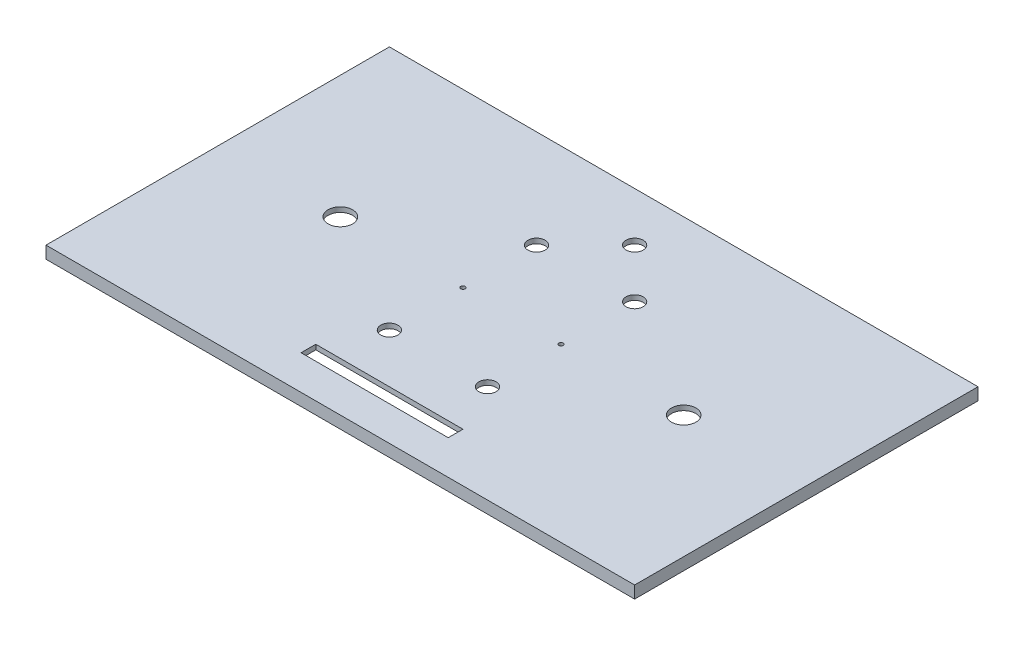
ISO-10303-21;
HEADER;
FILE_DESCRIPTION(('STEP AP214'),'2;1');
FILE_NAME('part.step','',(''),(''),'','','');
FILE_SCHEMA(('AUTOMOTIVE_DESIGN { 1 0 10303 214 1 1 1 1 }'));
ENDSEC;
DATA;
#1=APPLICATION_CONTEXT('core data for automotive mechanical design processes');
#2=APPLICATION_PROTOCOL_DEFINITION('international standard','automotive_design',2000,#1);
#3=PRODUCT_CONTEXT('',#1,'mechanical');
#4=PRODUCT('Part','Part','',(#3));
#5=PRODUCT_RELATED_PRODUCT_CATEGORY('part','',(#4));
#6=PRODUCT_DEFINITION_FORMATION('','',#4);
#7=PRODUCT_DEFINITION_CONTEXT('part definition',#1,'design');
#8=PRODUCT_DEFINITION('design','',#6,#7);
#9=PRODUCT_DEFINITION_SHAPE('','',#8);
#10=(LENGTH_UNIT() NAMED_UNIT(*) SI_UNIT(.MILLI.,.METRE.));
#11=(NAMED_UNIT(*) PLANE_ANGLE_UNIT() SI_UNIT($,.RADIAN.));
#12=(NAMED_UNIT(*) SI_UNIT($,.STERADIAN.) SOLID_ANGLE_UNIT());
#13=UNCERTAINTY_MEASURE_WITH_UNIT(LENGTH_MEASURE(1.E-05),#10,'distance_accuracy_value','');
#14=(GEOMETRIC_REPRESENTATION_CONTEXT(3) GLOBAL_UNCERTAINTY_ASSIGNED_CONTEXT((#13)) GLOBAL_UNIT_ASSIGNED_CONTEXT((#10,
#11,#12)) REPRESENTATION_CONTEXT('',''));
#15=CARTESIAN_POINT('',(0.,0.,0.));
#16=DIRECTION('',(0.,0.,1.));
#17=DIRECTION('',(1.,0.,0.));
#18=AXIS2_PLACEMENT_3D('',#15,#16,#17);
#19=CARTESIAN_POINT('',(-149.86,101.6,-88.9));
#20=DIRECTION('',(1.,0.,0.));
#21=DIRECTION('',(0.,0.,-1.));
#22=AXIS2_PLACEMENT_3D('',#19,#20,#21);
#23=PLANE('',#22);
#24=DIRECTION('',(0.,0.,1.));
#25=VECTOR('',#24,1.);
#26=CARTESIAN_POINT('',(-149.86,95.25,-88.9));
#27=LINE('',#26,#25);
#28=CARTESIAN_POINT('',(-149.86,95.25,-86.36));
#29=VERTEX_POINT('',#28);
#30=CARTESIAN_POINT('',(-149.86,95.25,86.36));
#31=VERTEX_POINT('',#30);
#32=EDGE_CURVE('E172',#29,#31,#27,.T.);
#33=ORIENTED_EDGE('',*,*,#32,.F.);
#34=DIRECTION('',(0.,-1.,0.));
#35=VECTOR('',#34,1.);
#36=CARTESIAN_POINT('',(-149.86,101.6,-86.36));
#37=LINE('',#36,#35);
#38=CARTESIAN_POINT('',(-149.86,99.06,-86.36));
#39=VERTEX_POINT('',#38);
#40=EDGE_CURVE('E36',#39,#29,#37,.T.);
#41=ORIENTED_EDGE('',*,*,#40,.F.);
#42=DIRECTION('',(0.,0.,1.));
#43=VECTOR('',#42,1.);
#44=CARTESIAN_POINT('',(-149.86,99.06,-88.9));
#45=LINE('',#44,#43);
#46=CARTESIAN_POINT('',(-149.86,99.06,86.36));
#47=VERTEX_POINT('',#46);
#48=EDGE_CURVE('E151',#39,#47,#45,.T.);
#49=ORIENTED_EDGE('',*,*,#48,.T.);
#50=DIRECTION('',(0.,-1.,0.));
#51=VECTOR('',#50,1.);
#52=CARTESIAN_POINT('',(-149.86,101.6,86.36));
#53=LINE('',#52,#51);
#54=EDGE_CURVE('E159',#47,#31,#53,.T.);
#55=ORIENTED_EDGE('',*,*,#54,.T.);
#56=EDGE_LOOP('',(#33,#41,#49,#55));
#57=FACE_BOUND('',#56,.T.);
#58=ADVANCED_FACE('F32',(#57),#23,.T.);
#59=CARTESIAN_POINT('',(-152.4,101.6,86.36));
#60=DIRECTION('',(0.,0.,-1.));
#61=DIRECTION('',(-1.,0.,0.));
#62=AXIS2_PLACEMENT_3D('',#59,#60,#61);
#63=PLANE('',#62);
#64=DIRECTION('',(1.,0.,0.));
#65=VECTOR('',#64,1.);
#66=CARTESIAN_POINT('',(-152.4,95.25,86.36));
#67=LINE('',#66,#65);
#68=CARTESIAN_POINT('',(149.86,95.25,86.36));
#69=VERTEX_POINT('',#68);
#70=EDGE_CURVE('E181',#31,#69,#67,.T.);
#71=ORIENTED_EDGE('',*,*,#70,.F.);
#72=ORIENTED_EDGE('',*,*,#54,.F.);
#73=DIRECTION('',(1.,0.,0.));
#74=VECTOR('',#73,1.);
#75=CARTESIAN_POINT('',(-152.4,99.06,86.36));
#76=LINE('',#75,#74);
#77=CARTESIAN_POINT('',(149.86,99.06,86.36));
#78=VERTEX_POINT('',#77);
#79=EDGE_CURVE('E149',#47,#78,#76,.T.);
#80=ORIENTED_EDGE('',*,*,#79,.T.);
#81=DIRECTION('',(0.,-1.,0.));
#82=VECTOR('',#81,1.);
#83=CARTESIAN_POINT('',(149.86,101.6,86.36));
#84=LINE('',#83,#82);
#85=EDGE_CURVE('E157',#78,#69,#84,.T.);
#86=ORIENTED_EDGE('',*,*,#85,.T.);
#87=EDGE_LOOP('',(#71,#72,#80,#86));
#88=FACE_BOUND('',#87,.T.);
#89=ADVANCED_FACE('F178',(#88),#63,.T.);
#90=CARTESIAN_POINT('',(149.86,101.6,-88.9));
#91=DIRECTION('',(-1.,0.,0.));
#92=DIRECTION('',(0.,0.,1.));
#93=AXIS2_PLACEMENT_3D('',#90,#91,#92);
#94=PLANE('',#93);
#95=DIRECTION('',(0.,0.,-1.));
#96=VECTOR('',#95,1.);
#97=CARTESIAN_POINT('',(149.86,95.25,-88.9));
#98=LINE('',#97,#96);
#99=CARTESIAN_POINT('',(149.86,95.25,-86.36));
#100=VERTEX_POINT('',#99);
#101=EDGE_CURVE('E49',#69,#100,#98,.T.);
#102=ORIENTED_EDGE('',*,*,#101,.F.);
#103=ORIENTED_EDGE('',*,*,#85,.F.);
#104=DIRECTION('',(0.,0.,-1.));
#105=VECTOR('',#104,1.);
#106=CARTESIAN_POINT('',(149.86,99.06,-88.9));
#107=LINE('',#106,#105);
#108=CARTESIAN_POINT('',(149.86,99.06,-86.36));
#109=VERTEX_POINT('',#108);
#110=EDGE_CURVE('E41',#78,#109,#107,.T.);
#111=ORIENTED_EDGE('',*,*,#110,.T.);
#112=DIRECTION('',(0.,-1.,0.));
#113=VECTOR('',#112,1.);
#114=CARTESIAN_POINT('',(149.86,101.6,-86.36));
#115=LINE('',#114,#113);
#116=EDGE_CURVE('E154',#109,#100,#115,.T.);
#117=ORIENTED_EDGE('',*,*,#116,.T.);
#118=EDGE_LOOP('',(#102,#103,#111,#117));
#119=FACE_BOUND('',#118,.T.);
#120=ADVANCED_FACE('F180',(#119),#94,.T.);
#121=CARTESIAN_POINT('',(-152.4,101.6,-86.36));
#122=DIRECTION('',(0.,0.,1.));
#123=DIRECTION('',(1.,0.,0.));
#124=AXIS2_PLACEMENT_3D('',#121,#122,#123);
#125=PLANE('',#124);
#126=DIRECTION('',(-1.,0.,0.));
#127=VECTOR('',#126,1.);
#128=CARTESIAN_POINT('',(-152.4,95.25,-86.36));
#129=LINE('',#128,#127);
#130=EDGE_CURVE('E169',#100,#29,#129,.T.);
#131=ORIENTED_EDGE('',*,*,#130,.F.);
#132=ORIENTED_EDGE('',*,*,#116,.F.);
#133=DIRECTION('',(-1.,0.,0.));
#134=VECTOR('',#133,1.);
#135=CARTESIAN_POINT('',(-152.4,99.06,-86.36));
#136=LINE('',#135,#134);
#137=EDGE_CURVE('E11',#109,#39,#136,.T.);
#138=ORIENTED_EDGE('',*,*,#137,.T.);
#139=ORIENTED_EDGE('',*,*,#40,.T.);
#140=EDGE_LOOP('',(#131,#132,#138,#139));
#141=FACE_BOUND('',#140,.T.);
#142=ADVANCED_FACE('F167',(#141),#125,.T.);
#143=CARTESIAN_POINT('',(0.,99.06,0.));
#144=DIRECTION('',(0.,1.,0.));
#145=DIRECTION('',(0.,0.,1.));
#146=AXIS2_PLACEMENT_3D('',#143,#144,#145);
#147=PLANE('',#146);
#148=DIRECTION('',(-1.,0.,0.));
#149=VECTOR('',#148,1.);
#150=CARTESIAN_POINT('',(-38.1,99.06,63.5));
#151=LINE('',#150,#149);
#152=CARTESIAN_POINT('',(38.1,99.06,63.5));
#153=VERTEX_POINT('',#152);
#154=CARTESIAN_POINT('',(-38.1,99.06,63.5));
#155=VERTEX_POINT('',#154);
#156=EDGE_CURVE('E198',#153,#155,#151,.T.);
#157=ORIENTED_EDGE('',*,*,#156,.T.);
#158=DIRECTION('',(0.,0.,1.));
#159=VECTOR('',#158,1.);
#160=CARTESIAN_POINT('',(-38.1,99.06,63.5));
#161=LINE('',#160,#159);
#162=CARTESIAN_POINT('',(-38.1,99.06,71.12));
#163=VERTEX_POINT('',#162);
#164=EDGE_CURVE('E188',#155,#163,#161,.T.);
#165=ORIENTED_EDGE('',*,*,#164,.T.);
#166=DIRECTION('',(1.,0.,0.));
#167=VECTOR('',#166,1.);
#168=CARTESIAN_POINT('',(-38.1,99.06,71.12));
#169=LINE('',#168,#167);
#170=CARTESIAN_POINT('',(38.1,99.06,71.12));
#171=VERTEX_POINT('',#170);
#172=EDGE_CURVE('E191',#163,#171,#169,.T.);
#173=ORIENTED_EDGE('',*,*,#172,.T.);
#174=DIRECTION('',(0.,0.,-1.));
#175=VECTOR('',#174,1.);
#176=CARTESIAN_POINT('',(38.1,99.06,63.5));
#177=LINE('',#176,#175);
#178=EDGE_CURVE('E195',#171,#153,#177,.T.);
#179=ORIENTED_EDGE('',*,*,#178,.T.);
#180=EDGE_LOOP('',(#157,#165,#173,#179));
#181=FACE_BOUND('',#180,.T.);
#182=CARTESIAN_POINT('',(0.,99.06,-63.5));
#183=DIRECTION('',(0.,1.,0.));
#184=DIRECTION('',(0.,0.,1.));
#185=AXIS2_PLACEMENT_3D('',#182,#183,#184);
#186=CIRCLE('',#185,4.445);
#187=CARTESIAN_POINT('',(0.,99.06,-59.055));
#188=VERTEX_POINT('',#187);
#189=EDGE_CURVE('E220',#188,#188,#186,.T.);
#190=ORIENTED_EDGE('',*,*,#189,.T.);
#191=EDGE_LOOP('',(#190));
#192=FACE_BOUND('',#191,.T.);
#193=CARTESIAN_POINT('',(-25.4,99.06,38.1));
#194=DIRECTION('',(0.,1.,0.));
#195=DIRECTION('',(0.,0.,1.));
#196=AXIS2_PLACEMENT_3D('',#193,#194,#195);
#197=CIRCLE('',#196,4.445);
#198=CARTESIAN_POINT('',(-25.4,99.06,42.545));
#199=VERTEX_POINT('',#198);
#200=EDGE_CURVE('E226',#199,#199,#197,.T.);
#201=ORIENTED_EDGE('',*,*,#200,.T.);
#202=EDGE_LOOP('',(#201));
#203=FACE_BOUND('',#202,.T.);
#204=CARTESIAN_POINT('',(25.4,99.06,38.1));
#205=DIRECTION('',(0.,1.,0.));
#206=DIRECTION('',(0.,0.,1.));
#207=AXIS2_PLACEMENT_3D('',#204,#205,#206);
#208=CIRCLE('',#207,4.445);
#209=CARTESIAN_POINT('',(25.4,99.06,42.545));
#210=VERTEX_POINT('',#209);
#211=EDGE_CURVE('E232',#210,#210,#208,.T.);
#212=ORIENTED_EDGE('',*,*,#211,.T.);
#213=EDGE_LOOP('',(#212));
#214=FACE_BOUND('',#213,.T.);
#215=CARTESIAN_POINT('',(25.4,99.06,-38.1));
#216=DIRECTION('',(0.,1.,0.));
#217=DIRECTION('',(0.,0.,1.));
#218=AXIS2_PLACEMENT_3D('',#215,#216,#217);
#219=CIRCLE('',#218,4.445);
#220=CARTESIAN_POINT('',(25.4,99.06,-33.655));
#221=VERTEX_POINT('',#220);
#222=EDGE_CURVE('E238',#221,#221,#219,.T.);
#223=ORIENTED_EDGE('',*,*,#222,.T.);
#224=EDGE_LOOP('',(#223));
#225=FACE_BOUND('',#224,.T.);
#226=CARTESIAN_POINT('',(-25.4,99.06,-38.1));
#227=DIRECTION('',(0.,1.,0.));
#228=DIRECTION('',(0.,0.,1.));
#229=AXIS2_PLACEMENT_3D('',#226,#227,#228);
#230=CIRCLE('',#229,4.445);
#231=CARTESIAN_POINT('',(-25.4,99.06,-33.655));
#232=VERTEX_POINT('',#231);
#233=EDGE_CURVE('E244',#232,#232,#230,.T.);
#234=ORIENTED_EDGE('',*,*,#233,.T.);
#235=EDGE_LOOP('',(#234));
#236=FACE_BOUND('',#235,.T.);
#237=CARTESIAN_POINT('',(-25.4,99.06,0.));
#238=DIRECTION('',(0.,1.,0.));
#239=DIRECTION('',(0.,0.,1.));
#240=AXIS2_PLACEMENT_3D('',#237,#238,#239);
#241=CIRCLE('',#240,1.13029999999999);
#242=CARTESIAN_POINT('',(-25.4,99.06,1.13029999999999));
#243=VERTEX_POINT('',#242);
#244=EDGE_CURVE('E252',#243,#243,#241,.T.);
#245=ORIENTED_EDGE('',*,*,#244,.T.);
#246=EDGE_LOOP('',(#245));
#247=FACE_BOUND('',#246,.T.);
#248=CARTESIAN_POINT('',(25.4,99.06,0.));
#249=DIRECTION('',(0.,1.,0.));
#250=DIRECTION('',(0.,0.,1.));
#251=AXIS2_PLACEMENT_3D('',#248,#249,#250);
#252=CIRCLE('',#251,1.13029999999999);
#253=CARTESIAN_POINT('',(25.4,99.06,1.13029999999999));
#254=VERTEX_POINT('',#253);
#255=EDGE_CURVE('E258',#254,#254,#252,.T.);
#256=ORIENTED_EDGE('',*,*,#255,.T.);
#257=EDGE_LOOP('',(#256));
#258=FACE_BOUND('',#257,.T.);
#259=CARTESIAN_POINT('',(88.9,99.06,0.));
#260=DIRECTION('',(0.,1.,0.));
#261=DIRECTION('',(0.,0.,1.));
#262=AXIS2_PLACEMENT_3D('',#259,#260,#261);
#263=CIRCLE('',#262,6.35);
#264=CARTESIAN_POINT('',(88.9,99.06,6.35));
#265=VERTEX_POINT('',#264);
#266=EDGE_CURVE('E262',#265,#265,#263,.T.);
#267=ORIENTED_EDGE('',*,*,#266,.T.);
#268=EDGE_LOOP('',(#267));
#269=FACE_BOUND('',#268,.T.);
#270=CARTESIAN_POINT('',(-88.9,99.06,0.));
#271=DIRECTION('',(0.,1.,0.));
#272=DIRECTION('',(0.,0.,1.));
#273=AXIS2_PLACEMENT_3D('',#270,#271,#272);
#274=CIRCLE('',#273,6.35);
#275=CARTESIAN_POINT('',(-88.9,99.06,6.35));
#276=VERTEX_POINT('',#275);
#277=EDGE_CURVE('E268',#276,#276,#274,.T.);
#278=ORIENTED_EDGE('',*,*,#277,.T.);
#279=EDGE_LOOP('',(#278));
#280=FACE_BOUND('',#279,.T.);
#281=ORIENTED_EDGE('',*,*,#48,.F.);
#282=ORIENTED_EDGE('',*,*,#137,.F.);
#283=ORIENTED_EDGE('',*,*,#110,.F.);
#284=ORIENTED_EDGE('',*,*,#79,.F.);
#285=EDGE_LOOP('',(#281,#282,#283,#284));
#286=FACE_BOUND('',#285,.T.);
#287=ADVANCED_FACE('F34',(#181,#192,#203,#214,#225,#236,#247,#258,#269,#280,#286),#147,.F.);
#288=CARTESIAN_POINT('',(-88.9,99.06,0.));
#289=DIRECTION('',(0.,1.,0.));
#290=DIRECTION('',(0.,0.,1.));
#291=AXIS2_PLACEMENT_3D('',#288,#289,#290);
#292=CYLINDRICAL_SURFACE('',#291,6.35);
#293=ORIENTED_EDGE('',*,*,#277,.F.);
#294=EDGE_LOOP('',(#293));
#295=FACE_BOUND('',#294,.T.);
#296=CARTESIAN_POINT('',(-88.9,101.6,0.));
#297=DIRECTION('',(0.,1.,0.));
#298=DIRECTION('',(0.,0.,1.));
#299=AXIS2_PLACEMENT_3D('',#296,#297,#298);
#300=CIRCLE('',#299,6.35);
#301=CARTESIAN_POINT('',(-88.9,101.6,6.35));
#302=VERTEX_POINT('',#301);
#303=EDGE_CURVE('E265',#302,#302,#300,.T.);
#304=ORIENTED_EDGE('',*,*,#303,.T.);
#305=EDGE_LOOP('',(#304));
#306=FACE_BOUND('',#305,.T.);
#307=ADVANCED_FACE('F324',(#295,#306),#292,.F.);
#308=CARTESIAN_POINT('',(-152.4,101.6,-88.9));
#309=DIRECTION('',(1.,0.,0.));
#310=DIRECTION('',(0.,0.,-1.));
#311=AXIS2_PLACEMENT_3D('',#308,#309,#310);
#312=PLANE('',#311);
#313=DIRECTION('',(0.,-1.,0.));
#314=VECTOR('',#313,1.);
#315=CARTESIAN_POINT('',(-152.4,101.6,-88.9));
#316=LINE('',#315,#314);
#317=CARTESIAN_POINT('',(-152.4,101.6,-88.9));
#318=VERTEX_POINT('',#317);
#319=CARTESIAN_POINT('',(-152.4,95.25,-88.9));
#320=VERTEX_POINT('',#319);
#321=EDGE_CURVE('E144',#318,#320,#316,.T.);
#322=ORIENTED_EDGE('',*,*,#321,.T.);
#323=DIRECTION('',(0.,0.,-1.));
#324=VECTOR('',#323,1.);
#325=CARTESIAN_POINT('',(-152.4,95.25,88.9));
#326=LINE('',#325,#324);
#327=CARTESIAN_POINT('',(-152.4,95.25,88.9));
#328=VERTEX_POINT('',#327);
#329=EDGE_CURVE('E57',#328,#320,#326,.T.);
#330=ORIENTED_EDGE('',*,*,#329,.F.);
#331=DIRECTION('',(0.,-1.,0.));
#332=VECTOR('',#331,1.);
#333=CARTESIAN_POINT('',(-152.4,101.6,88.9));
#334=LINE('',#333,#332);
#335=CARTESIAN_POINT('',(-152.4,101.6,88.9));
#336=VERTEX_POINT('',#335);
#337=EDGE_CURVE('E137',#336,#328,#334,.T.);
#338=ORIENTED_EDGE('',*,*,#337,.F.);
#339=DIRECTION('',(0.,0.,1.));
#340=VECTOR('',#339,1.);
#341=CARTESIAN_POINT('',(-152.4,101.6,-88.9));
#342=LINE('',#341,#340);
#343=EDGE_CURVE('E271',#318,#336,#342,.T.);
#344=ORIENTED_EDGE('',*,*,#343,.F.);
#345=EDGE_LOOP('',(#322,#330,#338,#344));
#346=FACE_BOUND('',#345,.T.);
#347=ADVANCED_FACE('F284',(#346),#312,.F.);
#348=CARTESIAN_POINT('',(-152.4,101.6,88.9));
#349=DIRECTION('',(0.,0.,-1.));
#350=DIRECTION('',(-1.,0.,0.));
#351=AXIS2_PLACEMENT_3D('',#348,#349,#350);
#352=PLANE('',#351);
#353=ORIENTED_EDGE('',*,*,#337,.T.);
#354=DIRECTION('',(-1.,0.,0.));
#355=VECTOR('',#354,1.);
#356=CARTESIAN_POINT('',(152.4,95.25,88.8999999999999));
#357=LINE('',#356,#355);
#358=CARTESIAN_POINT('',(152.4,95.25,88.8999999999999));
#359=VERTEX_POINT('',#358);
#360=EDGE_CURVE('E123',#359,#328,#357,.T.);
#361=ORIENTED_EDGE('',*,*,#360,.F.);
#362=DIRECTION('',(0.,-1.,0.));
#363=VECTOR('',#362,1.);
#364=CARTESIAN_POINT('',(152.4,101.6,88.9));
#365=LINE('',#364,#363);
#366=CARTESIAN_POINT('',(152.4,101.6,88.9));
#367=VERTEX_POINT('',#366);
#368=EDGE_CURVE('E134',#367,#359,#365,.T.);
#369=ORIENTED_EDGE('',*,*,#368,.F.);
#370=DIRECTION('',(1.,0.,0.));
#371=VECTOR('',#370,1.);
#372=CARTESIAN_POINT('',(-152.4,101.6,88.9));
#373=LINE('',#372,#371);
#374=EDGE_CURVE('E276',#336,#367,#373,.T.);
#375=ORIENTED_EDGE('',*,*,#374,.F.);
#376=EDGE_LOOP('',(#353,#361,#369,#375));
#377=FACE_BOUND('',#376,.T.);
#378=ADVANCED_FACE('F133',(#377),#352,.F.);
#379=CARTESIAN_POINT('',(152.4,101.6,-88.9));
#380=DIRECTION('',(-1.,0.,0.));
#381=DIRECTION('',(0.,0.,1.));
#382=AXIS2_PLACEMENT_3D('',#379,#380,#381);
#383=PLANE('',#382);
#384=ORIENTED_EDGE('',*,*,#368,.T.);
#385=DIRECTION('',(0.,0.,-1.));
#386=VECTOR('',#385,1.);
#387=CARTESIAN_POINT('',(152.4,95.25,88.8999999999999));
#388=LINE('',#387,#386);
#389=CARTESIAN_POINT('',(152.4,95.25,-88.9));
#390=VERTEX_POINT('',#389);
#391=EDGE_CURVE('E120',#359,#390,#388,.T.);
#392=ORIENTED_EDGE('',*,*,#391,.T.);
#393=DIRECTION('',(0.,-1.,0.));
#394=VECTOR('',#393,1.);
#395=CARTESIAN_POINT('',(152.4,101.6,-88.9));
#396=LINE('',#395,#394);
#397=CARTESIAN_POINT('',(152.4,101.6,-88.9));
#398=VERTEX_POINT('',#397);
#399=EDGE_CURVE('E141',#398,#390,#396,.T.);
#400=ORIENTED_EDGE('',*,*,#399,.F.);
#401=DIRECTION('',(0.,0.,-1.));
#402=VECTOR('',#401,1.);
#403=CARTESIAN_POINT('',(152.4,101.6,-88.9));
#404=LINE('',#403,#402);
#405=EDGE_CURVE('E140',#367,#398,#404,.T.);
#406=ORIENTED_EDGE('',*,*,#405,.F.);
#407=EDGE_LOOP('',(#384,#392,#400,#406));
#408=FACE_BOUND('',#407,.T.);
#409=ADVANCED_FACE('F139',(#408),#383,.F.);
#410=CARTESIAN_POINT('',(-152.4,101.6,-88.9));
#411=DIRECTION('',(0.,0.,1.));
#412=DIRECTION('',(1.,0.,0.));
#413=AXIS2_PLACEMENT_3D('',#410,#411,#412);
#414=PLANE('',#413);
#415=ORIENTED_EDGE('',*,*,#399,.T.);
#416=DIRECTION('',(-1.,0.,0.));
#417=VECTOR('',#416,1.);
#418=CARTESIAN_POINT('',(152.4,95.25,-88.9));
#419=LINE('',#418,#417);
#420=EDGE_CURVE('E124',#390,#320,#419,.T.);
#421=ORIENTED_EDGE('',*,*,#420,.T.);
#422=ORIENTED_EDGE('',*,*,#321,.F.);
#423=DIRECTION('',(-1.,0.,0.));
#424=VECTOR('',#423,1.);
#425=CARTESIAN_POINT('',(-152.4,101.6,-88.9));
#426=LINE('',#425,#424);
#427=EDGE_CURVE('E279',#398,#318,#426,.T.);
#428=ORIENTED_EDGE('',*,*,#427,.F.);
#429=EDGE_LOOP('',(#415,#421,#422,#428));
#430=FACE_BOUND('',#429,.T.);
#431=ADVANCED_FACE('F287',(#430),#414,.F.);
#432=CARTESIAN_POINT('',(0.,101.6,0.));
#433=DIRECTION('',(0.,1.,0.));
#434=DIRECTION('',(0.,0.,1.));
#435=AXIS2_PLACEMENT_3D('',#432,#433,#434);
#436=PLANE('',#435);
#437=DIRECTION('',(0.,0.,1.));
#438=VECTOR('',#437,1.);
#439=CARTESIAN_POINT('',(-38.1,101.6,63.5));
#440=LINE('',#439,#438);
#441=CARTESIAN_POINT('',(-38.1,101.6,63.5));
#442=VERTEX_POINT('',#441);
#443=CARTESIAN_POINT('',(-38.1,101.6,71.12));
#444=VERTEX_POINT('',#443);
#445=EDGE_CURVE('E187',#442,#444,#440,.T.);
#446=ORIENTED_EDGE('',*,*,#445,.F.);
#447=DIRECTION('',(-1.,0.,0.));
#448=VECTOR('',#447,1.);
#449=CARTESIAN_POINT('',(-38.1,101.6,63.5));
#450=LINE('',#449,#448);
#451=CARTESIAN_POINT('',(38.1,101.6,63.5));
#452=VERTEX_POINT('',#451);
#453=EDGE_CURVE('E192',#452,#442,#450,.T.);
#454=ORIENTED_EDGE('',*,*,#453,.F.);
#455=DIRECTION('',(0.,0.,-1.));
#456=VECTOR('',#455,1.);
#457=CARTESIAN_POINT('',(38.1,101.6,63.5));
#458=LINE('',#457,#456);
#459=CARTESIAN_POINT('',(38.1,101.6,71.12));
#460=VERTEX_POINT('',#459);
#461=EDGE_CURVE('E206',#460,#452,#458,.T.);
#462=ORIENTED_EDGE('',*,*,#461,.F.);
#463=DIRECTION('',(1.,0.,0.));
#464=VECTOR('',#463,1.);
#465=CARTESIAN_POINT('',(-38.1,101.6,71.12));
#466=LINE('',#465,#464);
#467=EDGE_CURVE('E203',#444,#460,#466,.T.);
#468=ORIENTED_EDGE('',*,*,#467,.F.);
#469=EDGE_LOOP('',(#446,#454,#462,#468));
#470=FACE_BOUND('',#469,.T.);
#471=CARTESIAN_POINT('',(0.,101.6,-63.5));
#472=DIRECTION('',(0.,1.,0.));
#473=DIRECTION('',(0.,0.,1.));
#474=AXIS2_PLACEMENT_3D('',#471,#472,#473);
#475=CIRCLE('',#474,4.445);
#476=CARTESIAN_POINT('',(0.,101.6,-59.055));
#477=VERTEX_POINT('',#476);
#478=EDGE_CURVE('E213',#477,#477,#475,.T.);
#479=ORIENTED_EDGE('',*,*,#478,.F.);
#480=EDGE_LOOP('',(#479));
#481=FACE_BOUND('',#480,.T.);
#482=CARTESIAN_POINT('',(-25.4,101.6,38.1));
#483=DIRECTION('',(0.,1.,0.));
#484=DIRECTION('',(0.,0.,1.));
#485=AXIS2_PLACEMENT_3D('',#482,#483,#484);
#486=CIRCLE('',#485,4.445);
#487=CARTESIAN_POINT('',(-25.4,101.6,42.545));
#488=VERTEX_POINT('',#487);
#489=EDGE_CURVE('E223',#488,#488,#486,.T.);
#490=ORIENTED_EDGE('',*,*,#489,.F.);
#491=EDGE_LOOP('',(#490));
#492=FACE_BOUND('',#491,.T.);
#493=CARTESIAN_POINT('',(25.4,101.6,38.1));
#494=DIRECTION('',(0.,1.,0.));
#495=DIRECTION('',(0.,0.,1.));
#496=AXIS2_PLACEMENT_3D('',#493,#494,#495);
#497=CIRCLE('',#496,4.445);
#498=CARTESIAN_POINT('',(25.4,101.6,42.545));
#499=VERTEX_POINT('',#498);
#500=EDGE_CURVE('E229',#499,#499,#497,.T.);
#501=ORIENTED_EDGE('',*,*,#500,.F.);
#502=EDGE_LOOP('',(#501));
#503=FACE_BOUND('',#502,.T.);
#504=CARTESIAN_POINT('',(25.4,101.6,-38.1));
#505=DIRECTION('',(0.,1.,0.));
#506=DIRECTION('',(0.,0.,1.));
#507=AXIS2_PLACEMENT_3D('',#504,#505,#506);
#508=CIRCLE('',#507,4.445);
#509=CARTESIAN_POINT('',(25.4,101.6,-33.655));
#510=VERTEX_POINT('',#509);
#511=EDGE_CURVE('E235',#510,#510,#508,.T.);
#512=ORIENTED_EDGE('',*,*,#511,.F.);
#513=EDGE_LOOP('',(#512));
#514=FACE_BOUND('',#513,.T.);
#515=CARTESIAN_POINT('',(-25.4,101.6,-38.1));
#516=DIRECTION('',(0.,1.,0.));
#517=DIRECTION('',(0.,0.,1.));
#518=AXIS2_PLACEMENT_3D('',#515,#516,#517);
#519=CIRCLE('',#518,4.445);
#520=CARTESIAN_POINT('',(-25.4,101.6,-33.655));
#521=VERTEX_POINT('',#520);
#522=EDGE_CURVE('E241',#521,#521,#519,.T.);
#523=ORIENTED_EDGE('',*,*,#522,.F.);
#524=EDGE_LOOP('',(#523));
#525=FACE_BOUND('',#524,.T.);
#526=CARTESIAN_POINT('',(-25.4,101.6,0.));
#527=DIRECTION('',(0.,1.,0.));
#528=DIRECTION('',(0.,0.,1.));
#529=AXIS2_PLACEMENT_3D('',#526,#527,#528);
#530=CIRCLE('',#529,1.13029999999999);
#531=CARTESIAN_POINT('',(-25.4,101.6,1.13029999999999));
#532=VERTEX_POINT('',#531);
#533=EDGE_CURVE('E247',#532,#532,#530,.T.);
#534=ORIENTED_EDGE('',*,*,#533,.F.);
#535=EDGE_LOOP('',(#534));
#536=FACE_BOUND('',#535,.T.);
#537=CARTESIAN_POINT('',(25.4,101.6,0.));
#538=DIRECTION('',(0.,1.,0.));
#539=DIRECTION('',(0.,0.,1.));
#540=AXIS2_PLACEMENT_3D('',#537,#538,#539);
#541=CIRCLE('',#540,1.13029999999999);
#542=CARTESIAN_POINT('',(25.4,101.6,1.13029999999999));
#543=VERTEX_POINT('',#542);
#544=EDGE_CURVE('E255',#543,#543,#541,.T.);
#545=ORIENTED_EDGE('',*,*,#544,.F.);
#546=EDGE_LOOP('',(#545));
#547=FACE_BOUND('',#546,.T.);
#548=CARTESIAN_POINT('',(88.9,101.6,0.));
#549=DIRECTION('',(0.,1.,0.));
#550=DIRECTION('',(0.,0.,1.));
#551=AXIS2_PLACEMENT_3D('',#548,#549,#550);
#552=CIRCLE('',#551,6.35);
#553=CARTESIAN_POINT('',(88.9,101.6,6.35));
#554=VERTEX_POINT('',#553);
#555=EDGE_CURVE('E261',#554,#554,#552,.T.);
#556=ORIENTED_EDGE('',*,*,#555,.F.);
#557=EDGE_LOOP('',(#556));
#558=FACE_BOUND('',#557,.T.);
#559=ORIENTED_EDGE('',*,*,#303,.F.);
#560=EDGE_LOOP('',(#559));
#561=FACE_BOUND('',#560,.T.);
#562=ORIENTED_EDGE('',*,*,#343,.T.);
#563=ORIENTED_EDGE('',*,*,#374,.T.);
#564=ORIENTED_EDGE('',*,*,#405,.T.);
#565=ORIENTED_EDGE('',*,*,#427,.T.);
#566=EDGE_LOOP('',(#562,#563,#564,#565));
#567=FACE_BOUND('',#566,.T.);
#568=ADVANCED_FACE('F291',(#470,#481,#492,#503,#514,#525,#536,#547,#558,#561,#567),#436,.T.);
#569=CARTESIAN_POINT('',(88.9,99.06,0.));
#570=DIRECTION('',(0.,1.,0.));
#571=DIRECTION('',(0.,0.,1.));
#572=AXIS2_PLACEMENT_3D('',#569,#570,#571);
#573=CYLINDRICAL_SURFACE('',#572,6.35);
#574=ORIENTED_EDGE('',*,*,#266,.F.);
#575=EDGE_LOOP('',(#574));
#576=FACE_BOUND('',#575,.T.);
#577=ORIENTED_EDGE('',*,*,#555,.T.);
#578=EDGE_LOOP('',(#577));
#579=FACE_BOUND('',#578,.T.);
#580=ADVANCED_FACE('F293',(#576,#579),#573,.F.);
#581=CARTESIAN_POINT('',(25.4,101.6,0.));
#582=DIRECTION('',(0.,1.,0.));
#583=DIRECTION('',(0.,0.,1.));
#584=AXIS2_PLACEMENT_3D('',#581,#582,#583);
#585=CYLINDRICAL_SURFACE('',#584,1.13029999999999);
#586=ORIENTED_EDGE('',*,*,#255,.F.);
#587=EDGE_LOOP('',(#586));
#588=FACE_BOUND('',#587,.T.);
#589=ORIENTED_EDGE('',*,*,#544,.T.);
#590=EDGE_LOOP('',(#589));
#591=FACE_BOUND('',#590,.T.);
#592=ADVANCED_FACE('F300',(#588,#591),#585,.F.);
#593=CARTESIAN_POINT('',(-25.4,101.6,0.));
#594=DIRECTION('',(0.,1.,0.));
#595=DIRECTION('',(0.,0.,1.));
#596=AXIS2_PLACEMENT_3D('',#593,#594,#595);
#597=CYLINDRICAL_SURFACE('',#596,1.13029999999999);
#598=ORIENTED_EDGE('',*,*,#244,.F.);
#599=EDGE_LOOP('',(#598));
#600=FACE_BOUND('',#599,.T.);
#601=ORIENTED_EDGE('',*,*,#533,.T.);
#602=EDGE_LOOP('',(#601));
#603=FACE_BOUND('',#602,.T.);
#604=ADVANCED_FACE('F358',(#600,#603),#597,.F.);
#605=CARTESIAN_POINT('',(-25.4,99.06,-38.1));
#606=DIRECTION('',(0.,1.,0.));
#607=DIRECTION('',(0.,0.,1.));
#608=AXIS2_PLACEMENT_3D('',#605,#606,#607);
#609=CYLINDRICAL_SURFACE('',#608,4.445);
#610=ORIENTED_EDGE('',*,*,#233,.F.);
#611=EDGE_LOOP('',(#610));
#612=FACE_BOUND('',#611,.T.);
#613=ORIENTED_EDGE('',*,*,#522,.T.);
#614=EDGE_LOOP('',(#613));
#615=FACE_BOUND('',#614,.T.);
#616=ADVANCED_FACE('F365',(#612,#615),#609,.F.);
#617=CARTESIAN_POINT('',(25.4,99.06,-38.1));
#618=DIRECTION('',(0.,1.,0.));
#619=DIRECTION('',(0.,0.,1.));
#620=AXIS2_PLACEMENT_3D('',#617,#618,#619);
#621=CYLINDRICAL_SURFACE('',#620,4.445);
#622=ORIENTED_EDGE('',*,*,#222,.F.);
#623=EDGE_LOOP('',(#622));
#624=FACE_BOUND('',#623,.T.);
#625=ORIENTED_EDGE('',*,*,#511,.T.);
#626=EDGE_LOOP('',(#625));
#627=FACE_BOUND('',#626,.T.);
#628=ADVANCED_FACE('F371',(#624,#627),#621,.F.);
#629=CARTESIAN_POINT('',(25.4,99.06,38.1));
#630=DIRECTION('',(0.,1.,0.));
#631=DIRECTION('',(0.,0.,1.));
#632=AXIS2_PLACEMENT_3D('',#629,#630,#631);
#633=CYLINDRICAL_SURFACE('',#632,4.445);
#634=ORIENTED_EDGE('',*,*,#211,.F.);
#635=EDGE_LOOP('',(#634));
#636=FACE_BOUND('',#635,.T.);
#637=ORIENTED_EDGE('',*,*,#500,.T.);
#638=EDGE_LOOP('',(#637));
#639=FACE_BOUND('',#638,.T.);
#640=ADVANCED_FACE('F375',(#636,#639),#633,.F.);
#641=CARTESIAN_POINT('',(-25.4,99.06,38.1));
#642=DIRECTION('',(0.,1.,0.));
#643=DIRECTION('',(0.,0.,1.));
#644=AXIS2_PLACEMENT_3D('',#641,#642,#643);
#645=CYLINDRICAL_SURFACE('',#644,4.445);
#646=ORIENTED_EDGE('',*,*,#200,.F.);
#647=EDGE_LOOP('',(#646));
#648=FACE_BOUND('',#647,.T.);
#649=ORIENTED_EDGE('',*,*,#489,.T.);
#650=EDGE_LOOP('',(#649));
#651=FACE_BOUND('',#650,.T.);
#652=ADVANCED_FACE('F379',(#648,#651),#645,.F.);
#653=CARTESIAN_POINT('',(0.,99.06,-63.5));
#654=DIRECTION('',(0.,1.,0.));
#655=DIRECTION('',(0.,0.,1.));
#656=AXIS2_PLACEMENT_3D('',#653,#654,#655);
#657=CYLINDRICAL_SURFACE('',#656,4.445);
#658=ORIENTED_EDGE('',*,*,#189,.F.);
#659=EDGE_LOOP('',(#658));
#660=FACE_BOUND('',#659,.T.);
#661=ORIENTED_EDGE('',*,*,#478,.T.);
#662=EDGE_LOOP('',(#661));
#663=FACE_BOUND('',#662,.T.);
#664=ADVANCED_FACE('F383',(#660,#663),#657,.F.);
#665=CARTESIAN_POINT('',(-38.1,99.06,63.5));
#666=DIRECTION('',(-1.,0.,0.));
#667=DIRECTION('',(0.,0.,1.));
#668=AXIS2_PLACEMENT_3D('',#665,#666,#667);
#669=PLANE('',#668);
#670=ORIENTED_EDGE('',*,*,#445,.T.);
#671=DIRECTION('',(0.,1.,0.));
#672=VECTOR('',#671,1.);
#673=CARTESIAN_POINT('',(-38.1,99.06,71.12));
#674=LINE('',#673,#672);
#675=EDGE_CURVE('E201',#163,#444,#674,.T.);
#676=ORIENTED_EDGE('',*,*,#675,.F.);
#677=ORIENTED_EDGE('',*,*,#164,.F.);
#678=DIRECTION('',(0.,1.,0.));
#679=VECTOR('',#678,1.);
#680=CARTESIAN_POINT('',(-38.1,99.06,63.5));
#681=LINE('',#680,#679);
#682=EDGE_CURVE('E211',#155,#442,#681,.T.);
#683=ORIENTED_EDGE('',*,*,#682,.T.);
#684=EDGE_LOOP('',(#670,#676,#677,#683));
#685=FACE_BOUND('',#684,.T.);
#686=ADVANCED_FACE('F387',(#685),#669,.F.);
#687=CARTESIAN_POINT('',(-38.1,99.06,63.5));
#688=DIRECTION('',(0.,0.,-1.));
#689=DIRECTION('',(-1.,0.,0.));
#690=AXIS2_PLACEMENT_3D('',#687,#688,#689);
#691=PLANE('',#690);
#692=ORIENTED_EDGE('',*,*,#453,.T.);
#693=ORIENTED_EDGE('',*,*,#682,.F.);
#694=ORIENTED_EDGE('',*,*,#156,.F.);
#695=DIRECTION('',(0.,1.,0.));
#696=VECTOR('',#695,1.);
#697=CARTESIAN_POINT('',(38.1,99.06,63.5));
#698=LINE('',#697,#696);
#699=EDGE_CURVE('E214',#153,#452,#698,.T.);
#700=ORIENTED_EDGE('',*,*,#699,.T.);
#701=EDGE_LOOP('',(#692,#693,#694,#700));
#702=FACE_BOUND('',#701,.T.);
#703=ADVANCED_FACE('F391',(#702),#691,.F.);
#704=CARTESIAN_POINT('',(38.1,99.06,63.5));
#705=DIRECTION('',(1.,0.,0.));
#706=DIRECTION('',(0.,0.,-1.));
#707=AXIS2_PLACEMENT_3D('',#704,#705,#706);
#708=PLANE('',#707);
#709=ORIENTED_EDGE('',*,*,#461,.T.);
#710=ORIENTED_EDGE('',*,*,#699,.F.);
#711=ORIENTED_EDGE('',*,*,#178,.F.);
#712=DIRECTION('',(0.,1.,0.));
#713=VECTOR('',#712,1.);
#714=CARTESIAN_POINT('',(38.1,99.06,71.12));
#715=LINE('',#714,#713);
#716=EDGE_CURVE('E216',#171,#460,#715,.T.);
#717=ORIENTED_EDGE('',*,*,#716,.T.);
#718=EDGE_LOOP('',(#709,#710,#711,#717));
#719=FACE_BOUND('',#718,.T.);
#720=ADVANCED_FACE('F396',(#719),#708,.F.);
#721=CARTESIAN_POINT('',(-38.1,99.06,71.12));
#722=DIRECTION('',(0.,0.,1.));
#723=DIRECTION('',(1.,0.,0.));
#724=AXIS2_PLACEMENT_3D('',#721,#722,#723);
#725=PLANE('',#724);
#726=ORIENTED_EDGE('',*,*,#467,.T.);
#727=ORIENTED_EDGE('',*,*,#716,.F.);
#728=ORIENTED_EDGE('',*,*,#172,.F.);
#729=ORIENTED_EDGE('',*,*,#675,.T.);
#730=EDGE_LOOP('',(#726,#727,#728,#729));
#731=FACE_BOUND('',#730,.T.);
#732=ADVANCED_FACE('F393',(#731),#725,.F.);
#733=CARTESIAN_POINT('',(152.4,95.25,88.8999999999999));
#734=DIRECTION('',(0.,1.,0.));
#735=DIRECTION('',(0.,0.,1.));
#736=AXIS2_PLACEMENT_3D('',#733,#734,#735);
#737=PLANE('',#736);
#738=ORIENTED_EDGE('',*,*,#32,.T.);
#739=ORIENTED_EDGE('',*,*,#70,.T.);
#740=ORIENTED_EDGE('',*,*,#101,.T.);
#741=ORIENTED_EDGE('',*,*,#130,.T.);
#742=EDGE_LOOP('',(#738,#739,#740,#741));
#743=FACE_BOUND('',#742,.T.);
#744=ORIENTED_EDGE('',*,*,#329,.T.);
#745=ORIENTED_EDGE('',*,*,#420,.F.);
#746=ORIENTED_EDGE('',*,*,#391,.F.);
#747=ORIENTED_EDGE('',*,*,#360,.T.);
#748=EDGE_LOOP('',(#744,#745,#746,#747));
#749=FACE_BOUND('',#748,.T.);
#750=ADVANCED_FACE('F122',(#743,#749),#737,.F.);
#751=CLOSED_SHELL('',(#58,#89,#120,#142,#287,#307,#347,#378,#409,#431,#568,#580,#592,#604,#616,
#628,#640,#652,#664,#686,#703,#720,#732,#750));
#752=MANIFOLD_SOLID_BREP('B2',#751);
#753=ADVANCED_BREP_SHAPE_REPRESENTATION('',(#18,#752),#14);
#754=SHAPE_DEFINITION_REPRESENTATION(#9,#753);
ENDSEC;
END-ISO-10303-21;
